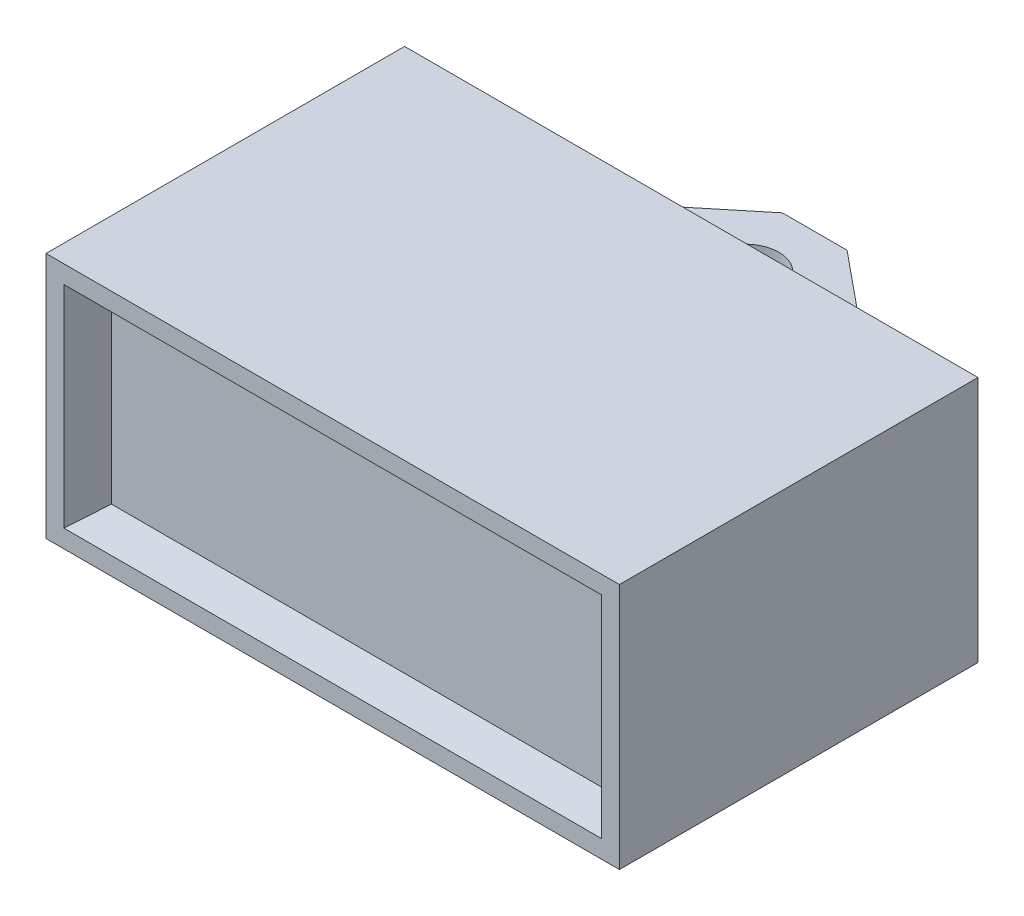
ISO-10303-21;
HEADER;
FILE_DESCRIPTION(('STEP AP214'),'2;1');
FILE_NAME('part.step','',(''),(''),'','','');
FILE_SCHEMA(('AUTOMOTIVE_DESIGN { 1 0 10303 214 1 1 1 1 }'));
ENDSEC;
DATA;
#1=APPLICATION_CONTEXT('core data for automotive mechanical design processes');
#2=APPLICATION_PROTOCOL_DEFINITION('international standard','automotive_design',2000,#1);
#3=PRODUCT_CONTEXT('',#1,'mechanical');
#4=PRODUCT('Part','Part','',(#3));
#5=PRODUCT_RELATED_PRODUCT_CATEGORY('part','',(#4));
#6=PRODUCT_DEFINITION_FORMATION('','',#4);
#7=PRODUCT_DEFINITION_CONTEXT('part definition',#1,'design');
#8=PRODUCT_DEFINITION('design','',#6,#7);
#9=PRODUCT_DEFINITION_SHAPE('','',#8);
#10=(LENGTH_UNIT() NAMED_UNIT(*) SI_UNIT(.MILLI.,.METRE.));
#11=(NAMED_UNIT(*) PLANE_ANGLE_UNIT() SI_UNIT($,.RADIAN.));
#12=(NAMED_UNIT(*) SI_UNIT($,.STERADIAN.) SOLID_ANGLE_UNIT());
#13=UNCERTAINTY_MEASURE_WITH_UNIT(LENGTH_MEASURE(1.E-05),#10,'distance_accuracy_value','');
#14=(GEOMETRIC_REPRESENTATION_CONTEXT(3) GLOBAL_UNCERTAINTY_ASSIGNED_CONTEXT((#13)) GLOBAL_UNIT_ASSIGNED_CONTEXT((#10,
#11,#12)) REPRESENTATION_CONTEXT('',''));
#15=CARTESIAN_POINT('',(0.,0.,0.));
#16=DIRECTION('',(0.,0.,1.));
#17=DIRECTION('',(1.,0.,0.));
#18=AXIS2_PLACEMENT_3D('',#15,#16,#17);
#19=CARTESIAN_POINT('',(553.103187826316,1190.39342140109,101.6635));
#20=DIRECTION('',(1.,0.,0.));
#21=DIRECTION('',(0.,0.,-1.));
#22=AXIS2_PLACEMENT_3D('',#19,#20,#21);
#23=PLANE('',#22);
#24=DIRECTION('',(0.,-1.,0.));
#25=VECTOR('',#24,1.);
#26=CARTESIAN_POINT('',(553.103187826316,1190.39342140109,0.));
#27=LINE('',#26,#25);
#28=CARTESIAN_POINT('',(553.103187826316,1260.38312140109,0.));
#29=VERTEX_POINT('',#28);
#30=CARTESIAN_POINT('',(553.103187826316,1190.39342140109,0.));
#31=VERTEX_POINT('',#30);
#32=EDGE_CURVE('E181',#29,#31,#27,.T.);
#33=ORIENTED_EDGE('',*,*,#32,.T.);
#34=DIRECTION('',(0.,0.,-1.));
#35=VECTOR('',#34,1.);
#36=CARTESIAN_POINT('',(553.103187826316,1190.39342140109,101.6635));
#37=LINE('',#36,#35);
#38=CARTESIAN_POINT('',(553.103187826316,1190.39342140109,101.6635));
#39=VERTEX_POINT('',#38);
#40=EDGE_CURVE('E11',#39,#31,#37,.T.);
#41=ORIENTED_EDGE('',*,*,#40,.F.);
#42=DIRECTION('',(0.,-1.,0.));
#43=VECTOR('',#42,1.);
#44=CARTESIAN_POINT('',(553.103187826316,1190.39342140109,101.6635));
#45=LINE('',#44,#43);
#46=CARTESIAN_POINT('',(553.103187826316,1260.38312140109,101.6635));
#47=VERTEX_POINT('',#46);
#48=EDGE_CURVE('E189',#47,#39,#45,.T.);
#49=ORIENTED_EDGE('',*,*,#48,.F.);
#50=DIRECTION('',(0.,0.,-1.));
#51=VECTOR('',#50,1.);
#52=CARTESIAN_POINT('',(553.103187826316,1260.38312140109,101.6635));
#53=LINE('',#52,#51);
#54=EDGE_CURVE('E199',#47,#29,#53,.T.);
#55=ORIENTED_EDGE('',*,*,#54,.T.);
#56=EDGE_LOOP('',(#33,#41,#49,#55));
#57=FACE_BOUND('',#56,.T.);
#58=ADVANCED_FACE('F38',(#57),#23,.F.);
#59=CARTESIAN_POINT('',(553.103187826316,1190.39342140109,101.6635));
#60=DIRECTION('',(0.,1.,0.));
#61=DIRECTION('',(0.,0.,1.));
#62=AXIS2_PLACEMENT_3D('',#59,#60,#61);
#63=PLANE('',#62);
#64=DIRECTION('',(1.,0.,0.));
#65=VECTOR('',#64,1.);
#66=CARTESIAN_POINT('',(553.103187826316,1190.39342140109,0.));
#67=LINE('',#66,#65);
#68=CARTESIAN_POINT('',(715.675887826316,1190.39342140109,0.));
#69=VERTEX_POINT('',#68);
#70=EDGE_CURVE('E201',#31,#69,#67,.T.);
#71=ORIENTED_EDGE('',*,*,#70,.T.);
#72=DIRECTION('',(0.,0.,-1.));
#73=VECTOR('',#72,1.);
#74=CARTESIAN_POINT('',(715.675887826316,1190.39342140109,101.6635));
#75=LINE('',#74,#73);
#76=CARTESIAN_POINT('',(715.675887826316,1190.39342140109,101.6635));
#77=VERTEX_POINT('',#76);
#78=EDGE_CURVE('E46',#77,#69,#75,.T.);
#79=ORIENTED_EDGE('',*,*,#78,.F.);
#80=DIRECTION('',(1.,0.,0.));
#81=VECTOR('',#80,1.);
#82=CARTESIAN_POINT('',(553.103187826316,1190.39342140109,101.6635));
#83=LINE('',#82,#81);
#84=EDGE_CURVE('E192',#39,#77,#83,.T.);
#85=ORIENTED_EDGE('',*,*,#84,.F.);
#86=ORIENTED_EDGE('',*,*,#40,.T.);
#87=EDGE_LOOP('',(#71,#79,#85,#86));
#88=FACE_BOUND('',#87,.T.);
#89=ADVANCED_FACE('F233',(#88),#63,.F.);
#90=CARTESIAN_POINT('',(715.675887826316,1190.39342140109,101.6635));
#91=DIRECTION('',(-1.,0.,0.));
#92=DIRECTION('',(0.,0.,1.));
#93=AXIS2_PLACEMENT_3D('',#90,#91,#92);
#94=PLANE('',#93);
#95=DIRECTION('',(0.,1.,0.));
#96=VECTOR('',#95,1.);
#97=CARTESIAN_POINT('',(715.675887826316,1190.39342140109,0.));
#98=LINE('',#97,#96);
#99=CARTESIAN_POINT('',(715.675887826316,1260.38312140109,0.));
#100=VERTEX_POINT('',#99);
#101=EDGE_CURVE('E203',#69,#100,#98,.T.);
#102=ORIENTED_EDGE('',*,*,#101,.T.);
#103=DIRECTION('',(0.,0.,-1.));
#104=VECTOR('',#103,1.);
#105=CARTESIAN_POINT('',(715.675887826316,1260.38312140109,101.6635));
#106=LINE('',#105,#104);
#107=CARTESIAN_POINT('',(715.675887826316,1260.38312140109,101.6635));
#108=VERTEX_POINT('',#107);
#109=EDGE_CURVE('E208',#108,#100,#106,.T.);
#110=ORIENTED_EDGE('',*,*,#109,.F.);
#111=DIRECTION('',(0.,1.,0.));
#112=VECTOR('',#111,1.);
#113=CARTESIAN_POINT('',(715.675887826316,1190.39342140109,101.6635));
#114=LINE('',#113,#112);
#115=EDGE_CURVE('E195',#77,#108,#114,.T.);
#116=ORIENTED_EDGE('',*,*,#115,.F.);
#117=ORIENTED_EDGE('',*,*,#78,.T.);
#118=EDGE_LOOP('',(#102,#110,#116,#117));
#119=FACE_BOUND('',#118,.T.);
#120=ADVANCED_FACE('F238',(#119),#94,.F.);
#121=CARTESIAN_POINT('',(553.103187826316,1260.38312140109,101.6635));
#122=DIRECTION('',(0.,-1.,0.));
#123=DIRECTION('',(0.,0.,-1.));
#124=AXIS2_PLACEMENT_3D('',#121,#122,#123);
#125=PLANE('',#124);
#126=DIRECTION('',(-1.,0.,0.));
#127=VECTOR('',#126,1.);
#128=CARTESIAN_POINT('',(553.103187826316,1260.38312140109,0.));
#129=LINE('',#128,#127);
#130=EDGE_CURVE('E193',#100,#29,#129,.T.);
#131=ORIENTED_EDGE('',*,*,#130,.T.);
#132=ORIENTED_EDGE('',*,*,#54,.F.);
#133=DIRECTION('',(-1.,0.,0.));
#134=VECTOR('',#133,1.);
#135=CARTESIAN_POINT('',(553.103187826316,1260.38312140109,101.6635));
#136=LINE('',#135,#134);
#137=EDGE_CURVE('E197',#108,#47,#136,.T.);
#138=ORIENTED_EDGE('',*,*,#137,.F.);
#139=ORIENTED_EDGE('',*,*,#109,.T.);
#140=EDGE_LOOP('',(#131,#132,#138,#139));
#141=FACE_BOUND('',#140,.T.);
#142=ADVANCED_FACE('F256',(#141),#125,.F.);
#143=CARTESIAN_POINT('',(0.,0.,101.6635));
#144=DIRECTION('',(0.,0.,-1.));
#145=DIRECTION('',(-1.,0.,0.));
#146=AXIS2_PLACEMENT_3D('',#143,#144,#145);
#147=PLANE('',#146);
#148=DIRECTION('',(-1.,0.,0.));
#149=VECTOR('',#148,1.);
#150=CARTESIAN_POINT('',(719.673112987139,1195.47342140109,101.6635));
#151=LINE('',#150,#149);
#152=CARTESIAN_POINT('',(710.595887826316,1195.47342140109,101.6635));
#153=VERTEX_POINT('',#152);
#154=CARTESIAN_POINT('',(558.183187826316,1195.47342140109,101.6635));
#155=VERTEX_POINT('',#154);
#156=EDGE_CURVE('E306',#153,#155,#151,.T.);
#157=ORIENTED_EDGE('',*,*,#156,.T.);
#158=DIRECTION('',(0.,1.,0.));
#159=VECTOR('',#158,1.);
#160=CARTESIAN_POINT('',(558.183187826316,1197.95627140109,101.6635));
#161=LINE('',#160,#159);
#162=CARTESIAN_POINT('',(558.183187826316,1255.30312140109,101.6635));
#163=VERTEX_POINT('',#162);
#164=EDGE_CURVE('E148',#155,#163,#161,.T.);
#165=ORIENTED_EDGE('',*,*,#164,.T.);
#166=DIRECTION('',(-1.,0.,0.));
#167=VECTOR('',#166,1.);
#168=CARTESIAN_POINT('',(719.673112987139,1255.30312140109,101.6635));
#169=LINE('',#168,#167);
#170=CARTESIAN_POINT('',(710.595887826316,1255.30312140109,101.6635));
#171=VERTEX_POINT('',#170);
#172=EDGE_CURVE('E305',#171,#163,#169,.T.);
#173=ORIENTED_EDGE('',*,*,#172,.F.);
#174=DIRECTION('',(0.,1.,0.));
#175=VECTOR('',#174,1.);
#176=CARTESIAN_POINT('',(710.595887826316,1197.95627140109,101.6635));
#177=LINE('',#176,#175);
#178=EDGE_CURVE('E140',#153,#171,#177,.T.);
#179=ORIENTED_EDGE('',*,*,#178,.F.);
#180=EDGE_LOOP('',(#157,#165,#173,#179));
#181=FACE_BOUND('',#180,.T.);
#182=ORIENTED_EDGE('',*,*,#48,.T.);
#183=ORIENTED_EDGE('',*,*,#84,.T.);
#184=ORIENTED_EDGE('',*,*,#115,.T.);
#185=ORIENTED_EDGE('',*,*,#137,.T.);
#186=EDGE_LOOP('',(#182,#183,#184,#185));
#187=FACE_BOUND('',#186,.T.);
#188=ADVANCED_FACE('F252',(#181,#187),#147,.F.);
#189=CARTESIAN_POINT('',(0.,0.,0.));
#190=DIRECTION('',(0.,0.,-1.));
#191=DIRECTION('',(-1.,0.,0.));
#192=AXIS2_PLACEMENT_3D('',#189,#190,#191);
#193=PLANE('',#192);
#194=ORIENTED_EDGE('',*,*,#130,.F.);
#195=ORIENTED_EDGE('',*,*,#101,.F.);
#196=ORIENTED_EDGE('',*,*,#70,.F.);
#197=ORIENTED_EDGE('',*,*,#32,.F.);
#198=EDGE_LOOP('',(#194,#195,#196,#197));
#199=FACE_BOUND('',#198,.T.);
#200=DIRECTION('',(0.,1.,0.));
#201=VECTOR('',#200,1.);
#202=CARTESIAN_POINT('',(582.567187826316,1190.39342140109,0.));
#203=LINE('',#202,#201);
#204=CARTESIAN_POINT('',(582.567187826316,1212.68827140109,0.));
#205=VERTEX_POINT('',#204);
#206=CARTESIAN_POINT('',(582.567187826316,1238.08827140109,0.));
#207=VERTEX_POINT('',#206);
#208=EDGE_CURVE('E178',#205,#207,#203,.T.);
#209=ORIENTED_EDGE('',*,*,#208,.F.);
#210=DIRECTION('',(-1.,0.,0.));
#211=VECTOR('',#210,1.);
#212=CARTESIAN_POINT('',(715.675887826316,1212.68827140109,0.));
#213=LINE('',#212,#211);
#214=CARTESIAN_POINT('',(686.211887826316,1212.68827140109,0.));
#215=VERTEX_POINT('',#214);
#216=EDGE_CURVE('E62',#215,#205,#213,.T.);
#217=ORIENTED_EDGE('',*,*,#216,.F.);
#218=DIRECTION('',(0.,1.,0.));
#219=VECTOR('',#218,1.);
#220=CARTESIAN_POINT('',(686.211887826316,1190.39342140109,0.));
#221=LINE('',#220,#219);
#222=CARTESIAN_POINT('',(686.211887826316,1238.08827140109,0.));
#223=VERTEX_POINT('',#222);
#224=EDGE_CURVE('E177',#215,#223,#221,.T.);
#225=ORIENTED_EDGE('',*,*,#224,.T.);
#226=DIRECTION('',(-1.,0.,0.));
#227=VECTOR('',#226,1.);
#228=CARTESIAN_POINT('',(715.675887826316,1238.08827140109,0.));
#229=LINE('',#228,#227);
#230=EDGE_CURVE('E54',#223,#207,#229,.T.);
#231=ORIENTED_EDGE('',*,*,#230,.T.);
#232=EDGE_LOOP('',(#209,#217,#225,#231));
#233=FACE_BOUND('',#232,.T.);
#234=ADVANCED_FACE('F248',(#199,#233),#193,.T.);
#235=CARTESIAN_POINT('',(582.567187826316,1190.39342140109,0.));
#236=DIRECTION('',(-0.634277802328891,0.,-0.773105212421203));
#237=DIRECTION('',(-0.773105212421203,0.,0.634277802328891));
#238=AXIS2_PLACEMENT_3D('',#235,#236,#237);
#239=PLANE('',#238);
#240=DIRECTION('',(0.773105212421203,0.,-0.634277802328891));
#241=VECTOR('',#240,1.);
#242=CARTESIAN_POINT('',(582.567187826316,1212.68827140109,0.));
#243=LINE('',#242,#241);
#244=CARTESIAN_POINT('',(625.213787826316,1212.68827140109,-34.9885));
#245=VERTEX_POINT('',#244);
#246=EDGE_CURVE('E175',#205,#245,#243,.T.);
#247=ORIENTED_EDGE('',*,*,#246,.F.);
#248=ORIENTED_EDGE('',*,*,#208,.T.);
#249=DIRECTION('',(-0.773105212421203,0.,0.634277802328891));
#250=VECTOR('',#249,1.);
#251=CARTESIAN_POINT('',(582.567187826316,1238.08827140109,0.));
#252=LINE('',#251,#250);
#253=CARTESIAN_POINT('',(625.213787826316,1238.08827140109,-34.9885));
#254=VERTEX_POINT('',#253);
#255=EDGE_CURVE('E171',#254,#207,#252,.T.);
#256=ORIENTED_EDGE('',*,*,#255,.F.);
#257=DIRECTION('',(0.,1.,0.));
#258=VECTOR('',#257,1.);
#259=CARTESIAN_POINT('',(625.213787826316,1190.39342140109,-34.9885));
#260=LINE('',#259,#258);
#261=EDGE_CURVE('E182',#245,#254,#260,.T.);
#262=ORIENTED_EDGE('',*,*,#261,.F.);
#263=EDGE_LOOP('',(#247,#248,#256,#262));
#264=FACE_BOUND('',#263,.T.);
#265=ADVANCED_FACE('F267',(#264),#239,.T.);
#266=CARTESIAN_POINT('',(625.213787826316,1190.39342140109,-34.9885));
#267=DIRECTION('',(0.,0.,-1.));
#268=DIRECTION('',(-1.,0.,0.));
#269=AXIS2_PLACEMENT_3D('',#266,#267,#268);
#270=PLANE('',#269);
#271=DIRECTION('',(-1.,0.,0.));
#272=VECTOR('',#271,1.);
#273=CARTESIAN_POINT('',(715.675887826316,1212.68827140109,-34.9885));
#274=LINE('',#273,#272);
#275=CARTESIAN_POINT('',(643.565287826316,1212.68827140109,-34.9885));
#276=VERTEX_POINT('',#275);
#277=EDGE_CURVE('E162',#276,#245,#274,.T.);
#278=ORIENTED_EDGE('',*,*,#277,.T.);
#279=ORIENTED_EDGE('',*,*,#261,.T.);
#280=DIRECTION('',(-1.,0.,0.));
#281=VECTOR('',#280,1.);
#282=CARTESIAN_POINT('',(715.675887826316,1238.08827140109,-34.9885));
#283=LINE('',#282,#281);
#284=CARTESIAN_POINT('',(643.565287826316,1238.08827140109,-34.9885));
#285=VERTEX_POINT('',#284);
#286=EDGE_CURVE('E156',#285,#254,#283,.T.);
#287=ORIENTED_EDGE('',*,*,#286,.F.);
#288=DIRECTION('',(0.,1.,0.));
#289=VECTOR('',#288,1.);
#290=CARTESIAN_POINT('',(643.565287826316,1190.39342140109,-34.9885));
#291=LINE('',#290,#289);
#292=EDGE_CURVE('E185',#276,#285,#291,.T.);
#293=ORIENTED_EDGE('',*,*,#292,.F.);
#294=EDGE_LOOP('',(#278,#279,#287,#293));
#295=FACE_BOUND('',#294,.T.);
#296=ADVANCED_FACE('F228',(#295),#270,.T.);
#297=CARTESIAN_POINT('',(643.565287826316,1190.39342140109,-34.9885));
#298=DIRECTION('',(0.63427780232889,0.,-0.773105212421203));
#299=DIRECTION('',(-0.773105212421203,0.,-0.63427780232889));
#300=AXIS2_PLACEMENT_3D('',#297,#298,#299);
#301=PLANE('',#300);
#302=DIRECTION('',(0.773105212421203,0.,0.63427780232889));
#303=VECTOR('',#302,1.);
#304=CARTESIAN_POINT('',(643.565287826316,1212.68827140109,-34.9885));
#305=LINE('',#304,#303);
#306=EDGE_CURVE('E173',#276,#215,#305,.T.);
#307=ORIENTED_EDGE('',*,*,#306,.F.);
#308=ORIENTED_EDGE('',*,*,#292,.T.);
#309=DIRECTION('',(-0.773105212421203,0.,-0.63427780232889));
#310=VECTOR('',#309,1.);
#311=CARTESIAN_POINT('',(643.565287826316,1238.08827140109,-34.9885));
#312=LINE('',#311,#310);
#313=EDGE_CURVE('E169',#223,#285,#312,.T.);
#314=ORIENTED_EDGE('',*,*,#313,.F.);
#315=ORIENTED_EDGE('',*,*,#224,.F.);
#316=EDGE_LOOP('',(#307,#308,#314,#315));
#317=FACE_BOUND('',#316,.T.);
#318=ADVANCED_FACE('F220',(#317),#301,.T.);
#319=CARTESIAN_POINT('',(715.675887826316,1238.08827140109,-34.9885));
#320=DIRECTION('',(0.,-1.,0.));
#321=DIRECTION('',(0.,0.,-1.));
#322=AXIS2_PLACEMENT_3D('',#319,#320,#321);
#323=PLANE('',#322);
#324=ORIENTED_EDGE('',*,*,#255,.T.);
#325=ORIENTED_EDGE('',*,*,#230,.F.);
#326=ORIENTED_EDGE('',*,*,#313,.T.);
#327=ORIENTED_EDGE('',*,*,#286,.T.);
#328=EDGE_LOOP('',(#324,#325,#326,#327));
#329=FACE_BOUND('',#328,.T.);
#330=CARTESIAN_POINT('',(634.389537826316,1238.08827140109,-15.3035));
#331=DIRECTION('',(0.,-1.,0.));
#332=DIRECTION('',(0.,0.,-1.));
#333=AXIS2_PLACEMENT_3D('',#330,#331,#332);
#334=CIRCLE('',#333,9.52500000000002);
#335=CARTESIAN_POINT('',(634.389537826316,1238.08827140109,-24.8285));
#336=VERTEX_POINT('',#335);
#337=EDGE_CURVE('E165',#336,#336,#334,.F.);
#338=ORIENTED_EDGE('',*,*,#337,.F.);
#339=EDGE_LOOP('',(#338));
#340=FACE_BOUND('',#339,.T.);
#341=ADVANCED_FACE('F217',(#329,#340),#323,.F.);
#342=CARTESIAN_POINT('',(715.675887826316,1212.68827140109,-34.9885));
#343=DIRECTION('',(0.,1.,0.));
#344=DIRECTION('',(0.,0.,1.));
#345=AXIS2_PLACEMENT_3D('',#342,#343,#344);
#346=PLANE('',#345);
#347=ORIENTED_EDGE('',*,*,#246,.T.);
#348=ORIENTED_EDGE('',*,*,#277,.F.);
#349=ORIENTED_EDGE('',*,*,#306,.T.);
#350=ORIENTED_EDGE('',*,*,#216,.T.);
#351=EDGE_LOOP('',(#347,#348,#349,#350));
#352=FACE_BOUND('',#351,.T.);
#353=CARTESIAN_POINT('',(634.389537826316,1212.68827140109,-15.3035));
#354=DIRECTION('',(0.,1.,0.));
#355=DIRECTION('',(0.,0.,1.));
#356=AXIS2_PLACEMENT_3D('',#353,#354,#355);
#357=CIRCLE('',#356,9.52500000000002);
#358=CARTESIAN_POINT('',(634.389537826316,1212.68827140109,-5.77849999999996));
#359=VERTEX_POINT('',#358);
#360=EDGE_CURVE('E41',#359,#359,#357,.F.);
#361=ORIENTED_EDGE('',*,*,#360,.F.);
#362=EDGE_LOOP('',(#361));
#363=FACE_BOUND('',#362,.T.);
#364=ADVANCED_FACE('F219',(#352,#363),#346,.F.);
#365=CARTESIAN_POINT('',(634.389537826316,1190.39342140109,-15.3035));
#366=DIRECTION('',(0.,1.,0.));
#367=DIRECTION('',(0.,0.,1.));
#368=AXIS2_PLACEMENT_3D('',#365,#366,#367);
#369=CYLINDRICAL_SURFACE('',#368,9.52500000000002);
#370=ORIENTED_EDGE('',*,*,#360,.T.);
#371=EDGE_LOOP('',(#370));
#372=FACE_BOUND('',#371,.T.);
#373=ORIENTED_EDGE('',*,*,#337,.T.);
#374=EDGE_LOOP('',(#373));
#375=FACE_BOUND('',#374,.T.);
#376=ADVANCED_FACE('F215',(#372,#375),#369,.F.);
#377=CARTESIAN_POINT('',(558.183187826316,1197.95627140109,101.6635));
#378=DIRECTION('',(-0.951034068730947,0.,-0.30908607233756));
#379=DIRECTION('',(-0.30908607233756,0.,0.951034068730947));
#380=AXIS2_PLACEMENT_3D('',#377,#378,#379);
#381=PLANE('',#380);
#382=DIRECTION('',(0.,1.,0.));
#383=VECTOR('',#382,1.);
#384=CARTESIAN_POINT('',(561.485187826316,1197.95627140109,91.5035));
#385=LINE('',#384,#383);
#386=CARTESIAN_POINT('',(561.485187826316,1197.95627140109,91.5035));
#387=VERTEX_POINT('',#386);
#388=CARTESIAN_POINT('',(561.485187826316,1252.82027140109,91.5035));
#389=VERTEX_POINT('',#388);
#390=EDGE_CURVE('E147',#387,#389,#385,.T.);
#391=ORIENTED_EDGE('',*,*,#390,.T.);
#392=DIRECTION('',(-0.301062221939514,0.226375632266079,0.926345298275419));
#393=VECTOR('',#392,1.);
#394=CARTESIAN_POINT('',(552.690722930967,1259.43303250509,118.563391985688));
#395=LINE('',#394,#393);
#396=EDGE_CURVE('E150',#389,#163,#395,.T.);
#397=ORIENTED_EDGE('',*,*,#396,.T.);
#398=ORIENTED_EDGE('',*,*,#164,.F.);
#399=DIRECTION('',(0.301062221939515,0.226375632266059,-0.926345298275424));
#400=VECTOR('',#399,1.);
#401=CARTESIAN_POINT('',(555.693434731163,1193.601318593,109.324278754316));
#402=LINE('',#401,#400);
#403=EDGE_CURVE('E133',#155,#387,#402,.T.);
#404=ORIENTED_EDGE('',*,*,#403,.T.);
#405=EDGE_LOOP('',(#391,#397,#398,#404));
#406=FACE_BOUND('',#405,.T.);
#407=ADVANCED_FACE('F145',(#406),#381,.F.);
#408=CARTESIAN_POINT('',(561.485187826316,1197.95627140109,91.5035));
#409=DIRECTION('',(0.,0.,-1.));
#410=DIRECTION('',(-1.,0.,0.));
#411=AXIS2_PLACEMENT_3D('',#408,#409,#410);
#412=PLANE('',#411);
#413=ORIENTED_EDGE('',*,*,#390,.F.);
#414=DIRECTION('',(-1.,0.,0.));
#415=VECTOR('',#414,1.);
#416=CARTESIAN_POINT('',(561.485187826316,1197.95627140109,91.5035));
#417=LINE('',#416,#415);
#418=CARTESIAN_POINT('',(707.293887826316,1197.95627140109,91.5035));
#419=VERTEX_POINT('',#418);
#420=EDGE_CURVE('E129',#419,#387,#417,.T.);
#421=ORIENTED_EDGE('',*,*,#420,.F.);
#422=DIRECTION('',(0.,1.,0.));
#423=VECTOR('',#422,1.);
#424=CARTESIAN_POINT('',(707.293887826316,1197.95627140109,91.5035));
#425=LINE('',#424,#423);
#426=CARTESIAN_POINT('',(707.293887826316,1252.82027140109,91.5035));
#427=VERTEX_POINT('',#426);
#428=EDGE_CURVE('E154',#419,#427,#425,.T.);
#429=ORIENTED_EDGE('',*,*,#428,.T.);
#430=DIRECTION('',(-1.,0.,0.));
#431=VECTOR('',#430,1.);
#432=CARTESIAN_POINT('',(561.485187826316,1252.82027140109,91.5035));
#433=LINE('',#432,#431);
#434=EDGE_CURVE('E141',#427,#389,#433,.T.);
#435=ORIENTED_EDGE('',*,*,#434,.T.);
#436=EDGE_LOOP('',(#413,#421,#429,#435));
#437=FACE_BOUND('',#436,.T.);
#438=ADVANCED_FACE('F152',(#437),#412,.F.);
#439=CARTESIAN_POINT('',(707.293887826316,1197.95627140109,91.5035));
#440=DIRECTION('',(0.951034068730947,0.,-0.30908607233756));
#441=DIRECTION('',(-0.30908607233756,0.,-0.951034068730947));
#442=AXIS2_PLACEMENT_3D('',#439,#440,#441);
#443=PLANE('',#442);
#444=ORIENTED_EDGE('',*,*,#178,.T.);
#445=DIRECTION('',(-0.301062221939514,-0.226375632266079,-0.926345298275419));
#446=VECTOR('',#445,1.);
#447=CARTESIAN_POINT('',(711.418633549393,1255.92176289671,104.195025301775));
#448=LINE('',#447,#446);
#449=EDGE_CURVE('E302',#171,#427,#448,.T.);
#450=ORIENTED_EDGE('',*,*,#449,.T.);
#451=ORIENTED_EDGE('',*,*,#428,.F.);
#452=DIRECTION('',(0.301062221939514,-0.226375632266079,0.926345298275419));
#453=VECTOR('',#452,1.);
#454=CARTESIAN_POINT('',(708.415921749197,1197.11258820138,94.9559120704032));
#455=LINE('',#454,#453);
#456=EDGE_CURVE('E135',#419,#153,#455,.T.);
#457=ORIENTED_EDGE('',*,*,#456,.T.);
#458=EDGE_LOOP('',(#444,#450,#451,#457));
#459=FACE_BOUND('',#458,.T.);
#460=ADVANCED_FACE('F288',(#459),#443,.F.);
#461=CARTESIAN_POINT('',(719.673112987139,1255.30312140109,101.6635));
#462=DIRECTION('',(0.,0.971414564697982,-0.237389434248094));
#463=DIRECTION('',(0.,0.237389434248094,0.971414564697982));
#464=AXIS2_PLACEMENT_3D('',#461,#462,#463);
#465=PLANE('',#464);
#466=ORIENTED_EDGE('',*,*,#172,.T.);
#467=ORIENTED_EDGE('',*,*,#396,.F.);
#468=ORIENTED_EDGE('',*,*,#434,.F.);
#469=ORIENTED_EDGE('',*,*,#449,.F.);
#470=EDGE_LOOP('',(#466,#467,#468,#469));
#471=FACE_BOUND('',#470,.T.);
#472=ADVANCED_FACE('F294',(#471),#465,.F.);
#473=CARTESIAN_POINT('',(719.673112987139,1197.95627140109,91.5035));
#474=DIRECTION('',(0.,-0.971414564697982,-0.237389434248094));
#475=DIRECTION('',(0.,0.237389434248094,-0.971414564697982));
#476=AXIS2_PLACEMENT_3D('',#473,#474,#475);
#477=PLANE('',#476);
#478=ORIENTED_EDGE('',*,*,#420,.T.);
#479=ORIENTED_EDGE('',*,*,#403,.F.);
#480=ORIENTED_EDGE('',*,*,#156,.F.);
#481=ORIENTED_EDGE('',*,*,#456,.F.);
#482=EDGE_LOOP('',(#478,#479,#480,#481));
#483=FACE_BOUND('',#482,.T.);
#484=ADVANCED_FACE('F131',(#483),#477,.F.);
#485=CLOSED_SHELL('',(#58,#89,#120,#142,#188,#234,#265,#296,#318,#341,#364,#376,#407,#438,#460,
#472,#484));
#486=MANIFOLD_SOLID_BREP('B2',#485);
#487=ADVANCED_BREP_SHAPE_REPRESENTATION('',(#18,#486),#14);
#488=SHAPE_DEFINITION_REPRESENTATION(#9,#487);
ENDSEC;
END-ISO-10303-21;
